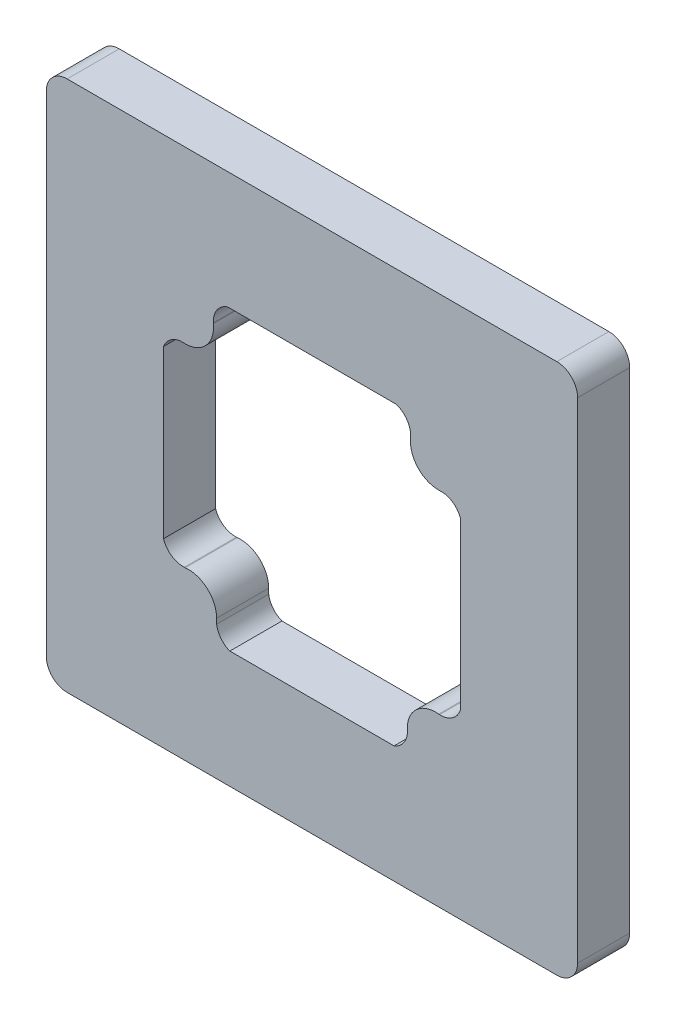
ISO-10303-21;
HEADER;
FILE_DESCRIPTION(('STEP AP214'),'2;1');
FILE_NAME('part.step','',(''),(''),'','','');
FILE_SCHEMA(('AUTOMOTIVE_DESIGN { 1 0 10303 214 1 1 1 1 }'));
ENDSEC;
DATA;
#1=APPLICATION_CONTEXT('core data for automotive mechanical design processes');
#2=APPLICATION_PROTOCOL_DEFINITION('international standard','automotive_design',2000,#1);
#3=PRODUCT_CONTEXT('',#1,'mechanical');
#4=PRODUCT('Part','Part','',(#3));
#5=PRODUCT_RELATED_PRODUCT_CATEGORY('part','',(#4));
#6=PRODUCT_DEFINITION_FORMATION('','',#4);
#7=PRODUCT_DEFINITION_CONTEXT('part definition',#1,'design');
#8=PRODUCT_DEFINITION('design','',#6,#7);
#9=PRODUCT_DEFINITION_SHAPE('','',#8);
#10=(LENGTH_UNIT() NAMED_UNIT(*) SI_UNIT(.MILLI.,.METRE.));
#11=(NAMED_UNIT(*) PLANE_ANGLE_UNIT() SI_UNIT($,.RADIAN.));
#12=(NAMED_UNIT(*) SI_UNIT($,.STERADIAN.) SOLID_ANGLE_UNIT());
#13=UNCERTAINTY_MEASURE_WITH_UNIT(LENGTH_MEASURE(1.E-05),#10,'distance_accuracy_value','');
#14=(GEOMETRIC_REPRESENTATION_CONTEXT(3) GLOBAL_UNCERTAINTY_ASSIGNED_CONTEXT((#13)) GLOBAL_UNIT_ASSIGNED_CONTEXT((#10,
#11,#12)) REPRESENTATION_CONTEXT('',''));
#15=CARTESIAN_POINT('',(0.,0.,0.));
#16=DIRECTION('',(0.,0.,1.));
#17=DIRECTION('',(1.,0.,0.));
#18=AXIS2_PLACEMENT_3D('',#15,#16,#17);
#19=CARTESIAN_POINT('',(-47.,-47.,5.));
#20=DIRECTION('',(0.,0.,1.));
#21=DIRECTION('',(1.,0.,0.));
#22=AXIS2_PLACEMENT_3D('',#19,#20,#21);
#23=PLANE('',#22);
#24=CARTESIAN_POINT('',(-47.,-47.,5.));
#25=DIRECTION('',(0.,0.,1.));
#26=DIRECTION('',(1.,0.,0.));
#27=AXIS2_PLACEMENT_3D('',#24,#25,#26);
#28=CIRCLE('',#27,4.);
#29=CARTESIAN_POINT('',(-51.,-47.,5.));
#30=VERTEX_POINT('',#29);
#31=CARTESIAN_POINT('',(-47.,-51.,5.));
#32=VERTEX_POINT('',#31);
#33=EDGE_CURVE('E498',#30,#32,#28,.T.);
#34=ORIENTED_EDGE('',*,*,#33,.T.);
#35=DIRECTION('',(1.,0.,0.));
#36=VECTOR('',#35,1.);
#37=CARTESIAN_POINT('',(-47.,-51.,5.));
#38=LINE('',#37,#36);
#39=CARTESIAN_POINT('',(47.,-51.,5.));
#40=VERTEX_POINT('',#39);
#41=EDGE_CURVE('E502',#32,#40,#38,.T.);
#42=ORIENTED_EDGE('',*,*,#41,.T.);
#43=CARTESIAN_POINT('',(47.,-47.,5.));
#44=DIRECTION('',(0.,0.,1.));
#45=DIRECTION('',(1.,0.,0.));
#46=AXIS2_PLACEMENT_3D('',#43,#44,#45);
#47=CIRCLE('',#46,4.);
#48=CARTESIAN_POINT('',(51.,-47.,5.));
#49=VERTEX_POINT('',#48);
#50=EDGE_CURVE('E506',#40,#49,#47,.T.);
#51=ORIENTED_EDGE('',*,*,#50,.T.);
#52=DIRECTION('',(0.,1.,0.));
#53=VECTOR('',#52,1.);
#54=CARTESIAN_POINT('',(51.,47.,5.));
#55=LINE('',#54,#53);
#56=CARTESIAN_POINT('',(51.,47.,5.));
#57=VERTEX_POINT('',#56);
#58=EDGE_CURVE('E509',#49,#57,#55,.T.);
#59=ORIENTED_EDGE('',*,*,#58,.T.);
#60=CARTESIAN_POINT('',(47.,47.,5.));
#61=DIRECTION('',(0.,0.,1.));
#62=DIRECTION('',(-1.,0.,0.));
#63=AXIS2_PLACEMENT_3D('',#60,#61,#62);
#64=CIRCLE('',#63,4.);
#65=CARTESIAN_POINT('',(47.,51.,5.));
#66=VERTEX_POINT('',#65);
#67=EDGE_CURVE('E512',#57,#66,#64,.T.);
#68=ORIENTED_EDGE('',*,*,#67,.T.);
#69=DIRECTION('',(-1.,0.,0.));
#70=VECTOR('',#69,1.);
#71=CARTESIAN_POINT('',(-47.,51.,5.));
#72=LINE('',#71,#70);
#73=CARTESIAN_POINT('',(-47.,51.,5.));
#74=VERTEX_POINT('',#73);
#75=EDGE_CURVE('E515',#66,#74,#72,.T.);
#76=ORIENTED_EDGE('',*,*,#75,.T.);
#77=CARTESIAN_POINT('',(-47.,47.,5.));
#78=DIRECTION('',(0.,0.,1.));
#79=DIRECTION('',(1.,0.,0.));
#80=AXIS2_PLACEMENT_3D('',#77,#78,#79);
#81=CIRCLE('',#80,3.99999999999999);
#82=CARTESIAN_POINT('',(-51.,47.,5.));
#83=VERTEX_POINT('',#82);
#84=EDGE_CURVE('E518',#74,#83,#81,.T.);
#85=ORIENTED_EDGE('',*,*,#84,.T.);
#86=DIRECTION('',(0.,-1.,0.));
#87=VECTOR('',#86,1.);
#88=CARTESIAN_POINT('',(-51.,47.,5.));
#89=LINE('',#88,#87);
#90=EDGE_CURVE('E521',#83,#30,#89,.T.);
#91=ORIENTED_EDGE('',*,*,#90,.T.);
#92=EDGE_LOOP('',(#34,#42,#51,#59,#68,#76,#85,#91));
#93=FACE_BOUND('',#92,.T.);
#94=DIRECTION('',(-1.,0.,0.));
#95=VECTOR('',#94,1.);
#96=CARTESIAN_POINT('',(-25.3142857142867,18.3000721519141,5.));
#97=LINE('',#96,#95);
#98=CARTESIAN_POINT('',(-24.3142857142867,18.3000721519141,5.));
#99=VERTEX_POINT('',#98);
#100=CARTESIAN_POINT('',(-25.3142857142867,18.3000721519141,5.));
#101=VERTEX_POINT('',#100);
#102=EDGE_CURVE('E258',#99,#101,#97,.T.);
#103=ORIENTED_EDGE('',*,*,#102,.F.);
#104=CARTESIAN_POINT('',(-24.3142857142866,23.7142857142872,5.));
#105=DIRECTION('',(0.,0.,-1.));
#106=DIRECTION('',(1.,0.,0.));
#107=AXIS2_PLACEMENT_3D('',#104,#105,#106);
#108=CIRCLE('',#107,5.41421356237309);
#109=CARTESIAN_POINT('',(-18.9357864376277,24.3351351565554,5.));
#110=VERTEX_POINT('',#109);
#111=EDGE_CURVE('E249',#110,#99,#108,.T.);
#112=ORIENTED_EDGE('',*,*,#111,.F.);
#113=DIRECTION('',(0.,-1.,0.));
#114=VECTOR('',#113,1.);
#115=CARTESIAN_POINT('',(-18.9357864376277,24.3351351565554,5.));
#116=LINE('',#115,#114);
#117=CARTESIAN_POINT('',(-18.9357864376278,24.5000000000015,5.));
#118=VERTEX_POINT('',#117);
#119=EDGE_CURVE('E338',#118,#110,#116,.T.);
#120=ORIENTED_EDGE('',*,*,#119,.F.);
#121=CARTESIAN_POINT('',(-14.9408403988752,24.7010128042281,5.));
#122=DIRECTION('',(0.,0.,1.));
#123=DIRECTION('',(1.,0.,0.));
#124=AXIS2_PLACEMENT_3D('',#121,#122,#123);
#125=CIRCLE('',#124,4.00000000000098);
#126=CARTESIAN_POINT('',(-16.1929171882011,28.5,5.));
#127=VERTEX_POINT('',#126);
#128=EDGE_CURVE('E335',#127,#118,#125,.T.);
#129=ORIENTED_EDGE('',*,*,#128,.F.);
#130=DIRECTION('',(-1.,0.,0.));
#131=VECTOR('',#130,1.);
#132=CARTESIAN_POINT('',(-16.1929171882011,28.5,5.));
#133=LINE('',#132,#131);
#134=CARTESIAN_POINT('',(16.1929171882011,28.5,5.));
#135=VERTEX_POINT('',#134);
#136=EDGE_CURVE('E332',#135,#127,#133,.T.);
#137=ORIENTED_EDGE('',*,*,#136,.F.);
#138=CARTESIAN_POINT('',(14.9408403988752,24.7010128042281,5.));
#139=DIRECTION('',(0.,0.,1.));
#140=DIRECTION('',(-1.,0.,0.));
#141=AXIS2_PLACEMENT_3D('',#138,#139,#140);
#142=CIRCLE('',#141,4.00000000000098);
#143=CARTESIAN_POINT('',(18.9357864376278,24.5000000000015,5.));
#144=VERTEX_POINT('',#143);
#145=EDGE_CURVE('E329',#144,#135,#142,.T.);
#146=ORIENTED_EDGE('',*,*,#145,.F.);
#147=DIRECTION('',(0.,1.,0.));
#148=VECTOR('',#147,1.);
#149=CARTESIAN_POINT('',(18.9357864376278,24.3351351565554,5.));
#150=LINE('',#149,#148);
#151=CARTESIAN_POINT('',(18.9357864376278,24.3351351565554,5.));
#152=VERTEX_POINT('',#151);
#153=EDGE_CURVE('E326',#152,#144,#150,.T.);
#154=ORIENTED_EDGE('',*,*,#153,.F.);
#155=CARTESIAN_POINT('',(24.3142857142867,23.7142857142872,5.));
#156=DIRECTION('',(0.,0.,-1.));
#157=DIRECTION('',(-1.,0.,0.));
#158=AXIS2_PLACEMENT_3D('',#155,#156,#157);
#159=CIRCLE('',#158,5.41421356237309);
#160=CARTESIAN_POINT('',(24.3142857142867,18.3000721519141,5.));
#161=VERTEX_POINT('',#160);
#162=EDGE_CURVE('E323',#161,#152,#159,.T.);
#163=ORIENTED_EDGE('',*,*,#162,.F.);
#164=DIRECTION('',(-1.,0.,0.));
#165=VECTOR('',#164,1.);
#166=CARTESIAN_POINT('',(25.3142857142867,18.3000721519141,5.));
#167=LINE('',#166,#165);
#168=CARTESIAN_POINT('',(25.3142857142867,18.3000721519141,5.));
#169=VERTEX_POINT('',#168);
#170=EDGE_CURVE('E320',#169,#161,#167,.T.);
#171=ORIENTED_EDGE('',*,*,#170,.F.);
#172=CARTESIAN_POINT('',(24.7628496387361,14.3382647039695,5.));
#173=DIRECTION('',(0.,0.,1.));
#174=DIRECTION('',(-1.,0.,0.));
#175=AXIS2_PLACEMENT_3D('',#172,#173,#174);
#176=CIRCLE('',#175,4.00000000000096);
#177=CARTESIAN_POINT('',(28.5,15.7643457596297,5.));
#178=VERTEX_POINT('',#177);
#179=EDGE_CURVE('E317',#178,#169,#176,.T.);
#180=ORIENTED_EDGE('',*,*,#179,.F.);
#181=DIRECTION('',(0.,1.,0.));
#182=VECTOR('',#181,1.);
#183=CARTESIAN_POINT('',(28.5,15.7643457596297,5.));
#184=LINE('',#183,#182);
#185=CARTESIAN_POINT('',(28.5,-16.1929171882011,5.));
#186=VERTEX_POINT('',#185);
#187=EDGE_CURVE('E314',#186,#178,#184,.T.);
#188=ORIENTED_EDGE('',*,*,#187,.F.);
#189=CARTESIAN_POINT('',(24.7010128042281,-14.9408403988752,5.));
#190=DIRECTION('',(0.,0.,1.));
#191=DIRECTION('',(-1.,0.,0.));
#192=AXIS2_PLACEMENT_3D('',#189,#190,#191);
#193=CIRCLE('',#192,4.000000000001);
#194=CARTESIAN_POINT('',(24.5000000000015,-18.9357864376277,5.));
#195=VERTEX_POINT('',#194);
#196=EDGE_CURVE('E311',#195,#186,#193,.T.);
#197=ORIENTED_EDGE('',*,*,#196,.F.);
#198=DIRECTION('',(1.,0.,0.));
#199=VECTOR('',#198,1.);
#200=CARTESIAN_POINT('',(24.3351351565554,-18.9357864376277,5.));
#201=LINE('',#200,#199);
#202=CARTESIAN_POINT('',(24.3351351565554,-18.9357864376277,5.));
#203=VERTEX_POINT('',#202);
#204=EDGE_CURVE('E308',#203,#195,#201,.T.);
#205=ORIENTED_EDGE('',*,*,#204,.F.);
#206=CARTESIAN_POINT('',(23.7142857142872,-24.3142857142866,5.));
#207=DIRECTION('',(0.,0.,-1.));
#208=DIRECTION('',(-1.,0.,0.));
#209=AXIS2_PLACEMENT_3D('',#206,#207,#208);
#210=CIRCLE('',#209,5.41421356237309);
#211=CARTESIAN_POINT('',(18.3000721519141,-24.3142857142867,5.));
#212=VERTEX_POINT('',#211);
#213=EDGE_CURVE('E305',#212,#203,#210,.T.);
#214=ORIENTED_EDGE('',*,*,#213,.F.);
#215=DIRECTION('',(0.,1.,0.));
#216=VECTOR('',#215,1.);
#217=CARTESIAN_POINT('',(18.3000721519141,-25.3142857142867,5.));
#218=LINE('',#217,#216);
#219=CARTESIAN_POINT('',(18.3000721519141,-25.3142857142867,5.));
#220=VERTEX_POINT('',#219);
#221=EDGE_CURVE('E302',#220,#212,#218,.T.);
#222=ORIENTED_EDGE('',*,*,#221,.F.);
#223=CARTESIAN_POINT('',(14.3382647039695,-24.7628496387361,5.));
#224=DIRECTION('',(0.,0.,1.));
#225=DIRECTION('',(-1.,0.,0.));
#226=AXIS2_PLACEMENT_3D('',#223,#224,#225);
#227=CIRCLE('',#226,4.00000000000096);
#228=CARTESIAN_POINT('',(15.7643457596297,-28.5,5.));
#229=VERTEX_POINT('',#228);
#230=EDGE_CURVE('E299',#229,#220,#227,.T.);
#231=ORIENTED_EDGE('',*,*,#230,.F.);
#232=DIRECTION('',(1.,0.,0.));
#233=VECTOR('',#232,1.);
#234=CARTESIAN_POINT('',(-15.7643457596297,-28.5,5.));
#235=LINE('',#234,#233);
#236=CARTESIAN_POINT('',(-15.7643457596297,-28.5,5.));
#237=VERTEX_POINT('',#236);
#238=EDGE_CURVE('E296',#237,#229,#235,.T.);
#239=ORIENTED_EDGE('',*,*,#238,.F.);
#240=CARTESIAN_POINT('',(-14.3382647039695,-24.7628496387361,5.));
#241=DIRECTION('',(0.,0.,1.));
#242=DIRECTION('',(1.,0.,0.));
#243=AXIS2_PLACEMENT_3D('',#240,#241,#242);
#244=CIRCLE('',#243,4.00000000000095);
#245=CARTESIAN_POINT('',(-18.3000721519141,-25.3142857142867,5.));
#246=VERTEX_POINT('',#245);
#247=EDGE_CURVE('E293',#246,#237,#244,.T.);
#248=ORIENTED_EDGE('',*,*,#247,.F.);
#249=DIRECTION('',(0.,-1.,0.));
#250=VECTOR('',#249,1.);
#251=CARTESIAN_POINT('',(-18.3000721519141,-25.3142857142867,5.));
#252=LINE('',#251,#250);
#253=CARTESIAN_POINT('',(-18.3000721519141,-24.3142857142867,5.));
#254=VERTEX_POINT('',#253);
#255=EDGE_CURVE('E290',#254,#246,#252,.T.);
#256=ORIENTED_EDGE('',*,*,#255,.F.);
#257=CARTESIAN_POINT('',(-23.7142857142872,-24.3142857142866,5.));
#258=DIRECTION('',(0.,0.,-1.));
#259=DIRECTION('',(1.,0.,0.));
#260=AXIS2_PLACEMENT_3D('',#257,#258,#259);
#261=CIRCLE('',#260,5.4142135623731);
#262=CARTESIAN_POINT('',(-24.3351351565554,-18.9357864376278,5.));
#263=VERTEX_POINT('',#262);
#264=EDGE_CURVE('E287',#263,#254,#261,.T.);
#265=ORIENTED_EDGE('',*,*,#264,.F.);
#266=DIRECTION('',(1.,1.26265134983278E-13,0.));
#267=VECTOR('',#266,1.);
#268=CARTESIAN_POINT('',(-24.3351351565554,-18.9357864376277,5.));
#269=LINE('',#268,#267);
#270=CARTESIAN_POINT('',(-24.5000000000015,-18.9357864376278,5.));
#271=VERTEX_POINT('',#270);
#272=EDGE_CURVE('E284',#271,#263,#269,.T.);
#273=ORIENTED_EDGE('',*,*,#272,.F.);
#274=CARTESIAN_POINT('',(-24.7010128042281,-14.9408403988752,5.));
#275=DIRECTION('',(0.,0.,1.));
#276=DIRECTION('',(1.,0.,0.));
#277=AXIS2_PLACEMENT_3D('',#274,#275,#276);
#278=CIRCLE('',#277,4.000000000001);
#279=CARTESIAN_POINT('',(-28.5,-16.1929171882011,5.));
#280=VERTEX_POINT('',#279);
#281=EDGE_CURVE('E281',#280,#271,#278,.T.);
#282=ORIENTED_EDGE('',*,*,#281,.F.);
#283=DIRECTION('',(0.,-1.,0.));
#284=VECTOR('',#283,1.);
#285=CARTESIAN_POINT('',(-28.5,15.7643457596297,5.));
#286=LINE('',#285,#284);
#287=CARTESIAN_POINT('',(-28.5,15.7643457596297,5.));
#288=VERTEX_POINT('',#287);
#289=EDGE_CURVE('E276',#288,#280,#286,.T.);
#290=ORIENTED_EDGE('',*,*,#289,.F.);
#291=CARTESIAN_POINT('',(-24.7628496387361,14.3382647039695,5.));
#292=DIRECTION('',(0.,0.,1.));
#293=DIRECTION('',(1.,0.,0.));
#294=AXIS2_PLACEMENT_3D('',#291,#292,#293);
#295=CIRCLE('',#294,4.00000000000096);
#296=EDGE_CURVE('E272',#101,#288,#295,.T.);
#297=ORIENTED_EDGE('',*,*,#296,.F.);
#298=EDGE_LOOP('',(#103,#112,#120,#129,#137,#146,#154,#163,#171,#180,#188,#197,#205,#214,#222,
#231,#239,#248,#256,#265,#273,#282,#290,#297));
#299=FACE_BOUND('',#298,.T.);
#300=ADVANCED_FACE('F39',(#93,#299),#23,.T.);
#301=CARTESIAN_POINT('',(-47.,-47.,-5.));
#302=DIRECTION('',(0.,0.,1.));
#303=DIRECTION('',(1.,0.,0.));
#304=AXIS2_PLACEMENT_3D('',#301,#302,#303);
#305=PLANE('',#304);
#306=CARTESIAN_POINT('',(-47.,-47.,-5.));
#307=DIRECTION('',(0.,0.,1.));
#308=DIRECTION('',(1.,0.,0.));
#309=AXIS2_PLACEMENT_3D('',#306,#307,#308);
#310=CIRCLE('',#309,4.);
#311=CARTESIAN_POINT('',(-51.,-47.,-5.));
#312=VERTEX_POINT('',#311);
#313=CARTESIAN_POINT('',(-47.,-51.,-5.));
#314=VERTEX_POINT('',#313);
#315=EDGE_CURVE('E267',#312,#314,#310,.T.);
#316=ORIENTED_EDGE('',*,*,#315,.F.);
#317=DIRECTION('',(0.,-1.,0.));
#318=VECTOR('',#317,1.);
#319=CARTESIAN_POINT('',(-51.,47.,-5.));
#320=LINE('',#319,#318);
#321=CARTESIAN_POINT('',(-51.,47.,-5.));
#322=VERTEX_POINT('',#321);
#323=EDGE_CURVE('E503',#322,#312,#320,.T.);
#324=ORIENTED_EDGE('',*,*,#323,.F.);
#325=CARTESIAN_POINT('',(-47.,47.,-5.));
#326=DIRECTION('',(0.,0.,1.));
#327=DIRECTION('',(1.,0.,0.));
#328=AXIS2_PLACEMENT_3D('',#325,#326,#327);
#329=CIRCLE('',#328,3.99999999999999);
#330=CARTESIAN_POINT('',(-47.,51.,-5.));
#331=VERTEX_POINT('',#330);
#332=EDGE_CURVE('E543',#331,#322,#329,.T.);
#333=ORIENTED_EDGE('',*,*,#332,.F.);
#334=DIRECTION('',(-1.,0.,0.));
#335=VECTOR('',#334,1.);
#336=CARTESIAN_POINT('',(-47.,51.,-5.));
#337=LINE('',#336,#335);
#338=CARTESIAN_POINT('',(47.,51.,-5.));
#339=VERTEX_POINT('',#338);
#340=EDGE_CURVE('E540',#339,#331,#337,.T.);
#341=ORIENTED_EDGE('',*,*,#340,.F.);
#342=CARTESIAN_POINT('',(47.,47.,-5.));
#343=DIRECTION('',(0.,0.,1.));
#344=DIRECTION('',(-1.,0.,0.));
#345=AXIS2_PLACEMENT_3D('',#342,#343,#344);
#346=CIRCLE('',#345,4.);
#347=CARTESIAN_POINT('',(51.,47.,-5.));
#348=VERTEX_POINT('',#347);
#349=EDGE_CURVE('E537',#348,#339,#346,.T.);
#350=ORIENTED_EDGE('',*,*,#349,.F.);
#351=DIRECTION('',(0.,1.,0.));
#352=VECTOR('',#351,1.);
#353=CARTESIAN_POINT('',(51.,47.,-5.));
#354=LINE('',#353,#352);
#355=CARTESIAN_POINT('',(51.,-47.,-5.));
#356=VERTEX_POINT('',#355);
#357=EDGE_CURVE('E534',#356,#348,#354,.T.);
#358=ORIENTED_EDGE('',*,*,#357,.F.);
#359=CARTESIAN_POINT('',(47.,-47.,-5.));
#360=DIRECTION('',(0.,0.,1.));
#361=DIRECTION('',(1.,0.,0.));
#362=AXIS2_PLACEMENT_3D('',#359,#360,#361);
#363=CIRCLE('',#362,4.);
#364=CARTESIAN_POINT('',(47.,-51.,-5.));
#365=VERTEX_POINT('',#364);
#366=EDGE_CURVE('E531',#365,#356,#363,.T.);
#367=ORIENTED_EDGE('',*,*,#366,.F.);
#368=DIRECTION('',(1.,0.,0.));
#369=VECTOR('',#368,1.);
#370=CARTESIAN_POINT('',(-47.,-51.,-5.));
#371=LINE('',#370,#369);
#372=EDGE_CURVE('E528',#314,#365,#371,.T.);
#373=ORIENTED_EDGE('',*,*,#372,.F.);
#374=EDGE_LOOP('',(#316,#324,#333,#341,#350,#358,#367,#373));
#375=FACE_BOUND('',#374,.T.);
#376=CARTESIAN_POINT('',(-24.3142857142866,23.7142857142872,-5.));
#377=DIRECTION('',(0.,0.,-1.));
#378=DIRECTION('',(1.,0.,0.));
#379=AXIS2_PLACEMENT_3D('',#376,#377,#378);
#380=CIRCLE('',#379,5.41421356237309);
#381=CARTESIAN_POINT('',(-18.9357864376277,24.3351351565554,-5.));
#382=VERTEX_POINT('',#381);
#383=CARTESIAN_POINT('',(-24.3142857142867,18.3000721519141,-5.));
#384=VERTEX_POINT('',#383);
#385=EDGE_CURVE('E63',#382,#384,#380,.T.);
#386=ORIENTED_EDGE('',*,*,#385,.T.);
#387=DIRECTION('',(-1.,0.,0.));
#388=VECTOR('',#387,1.);
#389=CARTESIAN_POINT('',(-25.3142857142867,18.3000721519141,-5.));
#390=LINE('',#389,#388);
#391=CARTESIAN_POINT('',(-25.3142857142867,18.3000721519141,-5.));
#392=VERTEX_POINT('',#391);
#393=EDGE_CURVE('E265',#384,#392,#390,.T.);
#394=ORIENTED_EDGE('',*,*,#393,.T.);
#395=CARTESIAN_POINT('',(-24.7628496387361,14.3382647039695,-5.));
#396=DIRECTION('',(0.,0.,1.));
#397=DIRECTION('',(1.,0.,0.));
#398=AXIS2_PLACEMENT_3D('',#395,#396,#397);
#399=CIRCLE('',#398,4.00000000000096);
#400=CARTESIAN_POINT('',(-28.5,15.7643457596297,-5.));
#401=VERTEX_POINT('',#400);
#402=EDGE_CURVE('E345',#392,#401,#399,.T.);
#403=ORIENTED_EDGE('',*,*,#402,.T.);
#404=DIRECTION('',(0.,-1.,0.));
#405=VECTOR('',#404,1.);
#406=CARTESIAN_POINT('',(-28.5,15.7643457596297,-5.));
#407=LINE('',#406,#405);
#408=CARTESIAN_POINT('',(-28.5,-16.1929171882011,-5.));
#409=VERTEX_POINT('',#408);
#410=EDGE_CURVE('E349',#401,#409,#407,.T.);
#411=ORIENTED_EDGE('',*,*,#410,.T.);
#412=CARTESIAN_POINT('',(-24.7010128042281,-14.9408403988752,-5.));
#413=DIRECTION('',(0.,0.,1.));
#414=DIRECTION('',(1.,0.,0.));
#415=AXIS2_PLACEMENT_3D('',#412,#413,#414);
#416=CIRCLE('',#415,4.000000000001);
#417=CARTESIAN_POINT('',(-24.5000000000015,-18.9357864376278,-5.));
#418=VERTEX_POINT('',#417);
#419=EDGE_CURVE('E353',#409,#418,#416,.T.);
#420=ORIENTED_EDGE('',*,*,#419,.T.);
#421=DIRECTION('',(1.,1.26265134983278E-13,0.));
#422=VECTOR('',#421,1.);
#423=CARTESIAN_POINT('',(-24.3351351565554,-18.9357864376277,-5.));
#424=LINE('',#423,#422);
#425=CARTESIAN_POINT('',(-24.3351351565554,-18.9357864376278,-5.));
#426=VERTEX_POINT('',#425);
#427=EDGE_CURVE('E357',#418,#426,#424,.T.);
#428=ORIENTED_EDGE('',*,*,#427,.T.);
#429=CARTESIAN_POINT('',(-23.7142857142872,-24.3142857142866,-5.));
#430=DIRECTION('',(0.,0.,-1.));
#431=DIRECTION('',(1.,0.,0.));
#432=AXIS2_PLACEMENT_3D('',#429,#430,#431);
#433=CIRCLE('',#432,5.4142135623731);
#434=CARTESIAN_POINT('',(-18.3000721519141,-24.3142857142867,-5.));
#435=VERTEX_POINT('',#434);
#436=EDGE_CURVE('E361',#426,#435,#433,.T.);
#437=ORIENTED_EDGE('',*,*,#436,.T.);
#438=DIRECTION('',(0.,-1.,0.));
#439=VECTOR('',#438,1.);
#440=CARTESIAN_POINT('',(-18.3000721519141,-25.3142857142867,-5.));
#441=LINE('',#440,#439);
#442=CARTESIAN_POINT('',(-18.3000721519141,-25.3142857142867,-5.));
#443=VERTEX_POINT('',#442);
#444=EDGE_CURVE('E365',#435,#443,#441,.T.);
#445=ORIENTED_EDGE('',*,*,#444,.T.);
#446=CARTESIAN_POINT('',(-14.3382647039695,-24.7628496387361,-5.));
#447=DIRECTION('',(0.,0.,1.));
#448=DIRECTION('',(1.,0.,0.));
#449=AXIS2_PLACEMENT_3D('',#446,#447,#448);
#450=CIRCLE('',#449,4.00000000000095);
#451=CARTESIAN_POINT('',(-15.7643457596297,-28.5,-5.));
#452=VERTEX_POINT('',#451);
#453=EDGE_CURVE('E369',#443,#452,#450,.T.);
#454=ORIENTED_EDGE('',*,*,#453,.T.);
#455=DIRECTION('',(1.,0.,0.));
#456=VECTOR('',#455,1.);
#457=CARTESIAN_POINT('',(-15.7643457596297,-28.5,-5.));
#458=LINE('',#457,#456);
#459=CARTESIAN_POINT('',(15.7643457596297,-28.5,-5.));
#460=VERTEX_POINT('',#459);
#461=EDGE_CURVE('E373',#452,#460,#458,.T.);
#462=ORIENTED_EDGE('',*,*,#461,.T.);
#463=CARTESIAN_POINT('',(14.3382647039695,-24.7628496387361,-5.));
#464=DIRECTION('',(0.,0.,1.));
#465=DIRECTION('',(-1.,0.,0.));
#466=AXIS2_PLACEMENT_3D('',#463,#464,#465);
#467=CIRCLE('',#466,4.00000000000096);
#468=CARTESIAN_POINT('',(18.3000721519141,-25.3142857142867,-5.));
#469=VERTEX_POINT('',#468);
#470=EDGE_CURVE('E377',#460,#469,#467,.T.);
#471=ORIENTED_EDGE('',*,*,#470,.T.);
#472=DIRECTION('',(0.,1.,0.));
#473=VECTOR('',#472,1.);
#474=CARTESIAN_POINT('',(18.3000721519141,-25.3142857142867,-5.));
#475=LINE('',#474,#473);
#476=CARTESIAN_POINT('',(18.3000721519141,-24.3142857142867,-5.));
#477=VERTEX_POINT('',#476);
#478=EDGE_CURVE('E381',#469,#477,#475,.T.);
#479=ORIENTED_EDGE('',*,*,#478,.T.);
#480=CARTESIAN_POINT('',(23.7142857142872,-24.3142857142866,-5.));
#481=DIRECTION('',(0.,0.,-1.));
#482=DIRECTION('',(-1.,0.,0.));
#483=AXIS2_PLACEMENT_3D('',#480,#481,#482);
#484=CIRCLE('',#483,5.41421356237309);
#485=CARTESIAN_POINT('',(24.3351351565554,-18.9357864376277,-5.));
#486=VERTEX_POINT('',#485);
#487=EDGE_CURVE('E385',#477,#486,#484,.T.);
#488=ORIENTED_EDGE('',*,*,#487,.T.);
#489=DIRECTION('',(1.,0.,0.));
#490=VECTOR('',#489,1.);
#491=CARTESIAN_POINT('',(24.3351351565554,-18.9357864376277,-5.));
#492=LINE('',#491,#490);
#493=CARTESIAN_POINT('',(24.5000000000015,-18.9357864376277,-5.));
#494=VERTEX_POINT('',#493);
#495=EDGE_CURVE('E389',#486,#494,#492,.T.);
#496=ORIENTED_EDGE('',*,*,#495,.T.);
#497=CARTESIAN_POINT('',(24.7010128042281,-14.9408403988752,-5.));
#498=DIRECTION('',(0.,0.,1.));
#499=DIRECTION('',(-1.,0.,0.));
#500=AXIS2_PLACEMENT_3D('',#497,#498,#499);
#501=CIRCLE('',#500,4.000000000001);
#502=CARTESIAN_POINT('',(28.5,-16.1929171882011,-5.));
#503=VERTEX_POINT('',#502);
#504=EDGE_CURVE('E393',#494,#503,#501,.T.);
#505=ORIENTED_EDGE('',*,*,#504,.T.);
#506=DIRECTION('',(0.,1.,0.));
#507=VECTOR('',#506,1.);
#508=CARTESIAN_POINT('',(28.5,15.7643457596297,-5.));
#509=LINE('',#508,#507);
#510=CARTESIAN_POINT('',(28.5,15.7643457596297,-5.));
#511=VERTEX_POINT('',#510);
#512=EDGE_CURVE('E397',#503,#511,#509,.T.);
#513=ORIENTED_EDGE('',*,*,#512,.T.);
#514=CARTESIAN_POINT('',(24.7628496387361,14.3382647039695,-5.));
#515=DIRECTION('',(0.,0.,1.));
#516=DIRECTION('',(-1.,0.,0.));
#517=AXIS2_PLACEMENT_3D('',#514,#515,#516);
#518=CIRCLE('',#517,4.00000000000096);
#519=CARTESIAN_POINT('',(25.3142857142867,18.3000721519141,-5.));
#520=VERTEX_POINT('',#519);
#521=EDGE_CURVE('E401',#511,#520,#518,.T.);
#522=ORIENTED_EDGE('',*,*,#521,.T.);
#523=DIRECTION('',(-1.,0.,0.));
#524=VECTOR('',#523,1.);
#525=CARTESIAN_POINT('',(25.3142857142867,18.3000721519141,-5.));
#526=LINE('',#525,#524);
#527=CARTESIAN_POINT('',(24.3142857142867,18.3000721519141,-5.));
#528=VERTEX_POINT('',#527);
#529=EDGE_CURVE('E405',#520,#528,#526,.T.);
#530=ORIENTED_EDGE('',*,*,#529,.T.);
#531=CARTESIAN_POINT('',(24.3142857142867,23.7142857142872,-5.));
#532=DIRECTION('',(0.,0.,-1.));
#533=DIRECTION('',(-1.,0.,0.));
#534=AXIS2_PLACEMENT_3D('',#531,#532,#533);
#535=CIRCLE('',#534,5.41421356237309);
#536=CARTESIAN_POINT('',(18.9357864376278,24.3351351565554,-5.));
#537=VERTEX_POINT('',#536);
#538=EDGE_CURVE('E409',#528,#537,#535,.T.);
#539=ORIENTED_EDGE('',*,*,#538,.T.);
#540=DIRECTION('',(0.,1.,0.));
#541=VECTOR('',#540,1.);
#542=CARTESIAN_POINT('',(18.9357864376278,24.3351351565554,-5.));
#543=LINE('',#542,#541);
#544=CARTESIAN_POINT('',(18.9357864376278,24.5000000000015,-5.));
#545=VERTEX_POINT('',#544);
#546=EDGE_CURVE('E413',#537,#545,#543,.T.);
#547=ORIENTED_EDGE('',*,*,#546,.T.);
#548=CARTESIAN_POINT('',(14.9408403988752,24.7010128042281,-5.));
#549=DIRECTION('',(0.,0.,1.));
#550=DIRECTION('',(-1.,0.,0.));
#551=AXIS2_PLACEMENT_3D('',#548,#549,#550);
#552=CIRCLE('',#551,4.00000000000098);
#553=CARTESIAN_POINT('',(16.1929171882011,28.5,-5.));
#554=VERTEX_POINT('',#553);
#555=EDGE_CURVE('E417',#545,#554,#552,.T.);
#556=ORIENTED_EDGE('',*,*,#555,.T.);
#557=DIRECTION('',(-1.,0.,0.));
#558=VECTOR('',#557,1.);
#559=CARTESIAN_POINT('',(-16.1929171882011,28.5,-5.));
#560=LINE('',#559,#558);
#561=CARTESIAN_POINT('',(-16.1929171882011,28.5,-5.));
#562=VERTEX_POINT('',#561);
#563=EDGE_CURVE('E421',#554,#562,#560,.T.);
#564=ORIENTED_EDGE('',*,*,#563,.T.);
#565=CARTESIAN_POINT('',(-14.9408403988752,24.7010128042281,-5.));
#566=DIRECTION('',(0.,0.,1.));
#567=DIRECTION('',(1.,0.,0.));
#568=AXIS2_PLACEMENT_3D('',#565,#566,#567);
#569=CIRCLE('',#568,4.00000000000098);
#570=CARTESIAN_POINT('',(-18.9357864376278,24.5000000000015,-5.));
#571=VERTEX_POINT('',#570);
#572=EDGE_CURVE('E425',#562,#571,#569,.T.);
#573=ORIENTED_EDGE('',*,*,#572,.T.);
#574=DIRECTION('',(0.,-1.,0.));
#575=VECTOR('',#574,1.);
#576=CARTESIAN_POINT('',(-18.9357864376277,24.3351351565554,-5.));
#577=LINE('',#576,#575);
#578=EDGE_CURVE('E259',#571,#382,#577,.T.);
#579=ORIENTED_EDGE('',*,*,#578,.T.);
#580=EDGE_LOOP('',(#386,#394,#403,#411,#420,#428,#437,#445,#454,#462,#471,#479,#488,#496,#505,
#513,#522,#530,#539,#547,#556,#564,#573,#579));
#581=FACE_BOUND('',#580,.T.);
#582=ADVANCED_FACE('F582',(#375,#581),#305,.F.);
#583=CARTESIAN_POINT('',(-47.,-47.,5.));
#584=DIRECTION('',(0.,0.,-1.));
#585=DIRECTION('',(-1.,0.,0.));
#586=AXIS2_PLACEMENT_3D('',#583,#584,#585);
#587=CYLINDRICAL_SURFACE('',#586,4.);
#588=ORIENTED_EDGE('',*,*,#315,.T.);
#589=DIRECTION('',(0.,0.,-1.));
#590=VECTOR('',#589,1.);
#591=CARTESIAN_POINT('',(-47.,-51.,5.));
#592=LINE('',#591,#590);
#593=EDGE_CURVE('E11',#32,#314,#592,.T.);
#594=ORIENTED_EDGE('',*,*,#593,.F.);
#595=ORIENTED_EDGE('',*,*,#33,.F.);
#596=DIRECTION('',(0.,0.,-1.));
#597=VECTOR('',#596,1.);
#598=CARTESIAN_POINT('',(-51.,-47.,5.));
#599=LINE('',#598,#597);
#600=EDGE_CURVE('E524',#30,#312,#599,.T.);
#601=ORIENTED_EDGE('',*,*,#600,.T.);
#602=EDGE_LOOP('',(#588,#594,#595,#601));
#603=FACE_BOUND('',#602,.T.);
#604=ADVANCED_FACE('F41',(#603),#587,.T.);
#605=CARTESIAN_POINT('',(-47.,-51.,5.));
#606=DIRECTION('',(0.,1.,0.));
#607=DIRECTION('',(0.,0.,1.));
#608=AXIS2_PLACEMENT_3D('',#605,#606,#607);
#609=PLANE('',#608);
#610=ORIENTED_EDGE('',*,*,#372,.T.);
#611=DIRECTION('',(0.,0.,-1.));
#612=VECTOR('',#611,1.);
#613=CARTESIAN_POINT('',(47.,-51.,5.));
#614=LINE('',#613,#612);
#615=EDGE_CURVE('E48',#40,#365,#614,.T.);
#616=ORIENTED_EDGE('',*,*,#615,.F.);
#617=ORIENTED_EDGE('',*,*,#41,.F.);
#618=ORIENTED_EDGE('',*,*,#593,.T.);
#619=EDGE_LOOP('',(#610,#616,#617,#618));
#620=FACE_BOUND('',#619,.T.);
#621=ADVANCED_FACE('F599',(#620),#609,.F.);
#622=CARTESIAN_POINT('',(47.,-47.,5.));
#623=DIRECTION('',(0.,0.,-1.));
#624=DIRECTION('',(-1.,0.,0.));
#625=AXIS2_PLACEMENT_3D('',#622,#623,#624);
#626=CYLINDRICAL_SURFACE('',#625,4.);
#627=ORIENTED_EDGE('',*,*,#366,.T.);
#628=DIRECTION('',(0.,0.,-1.));
#629=VECTOR('',#628,1.);
#630=CARTESIAN_POINT('',(51.,-47.,5.));
#631=LINE('',#630,#629);
#632=EDGE_CURVE('E567',#49,#356,#631,.T.);
#633=ORIENTED_EDGE('',*,*,#632,.F.);
#634=ORIENTED_EDGE('',*,*,#50,.F.);
#635=ORIENTED_EDGE('',*,*,#615,.T.);
#636=EDGE_LOOP('',(#627,#633,#634,#635));
#637=FACE_BOUND('',#636,.T.);
#638=ADVANCED_FACE('F576',(#637),#626,.T.);
#639=CARTESIAN_POINT('',(51.,47.,5.));
#640=DIRECTION('',(-1.,0.,0.));
#641=DIRECTION('',(0.,0.,1.));
#642=AXIS2_PLACEMENT_3D('',#639,#640,#641);
#643=PLANE('',#642);
#644=ORIENTED_EDGE('',*,*,#357,.T.);
#645=DIRECTION('',(0.,0.,-1.));
#646=VECTOR('',#645,1.);
#647=CARTESIAN_POINT('',(51.,47.,5.));
#648=LINE('',#647,#646);
#649=EDGE_CURVE('E563',#57,#348,#648,.T.);
#650=ORIENTED_EDGE('',*,*,#649,.F.);
#651=ORIENTED_EDGE('',*,*,#58,.F.);
#652=ORIENTED_EDGE('',*,*,#632,.T.);
#653=EDGE_LOOP('',(#644,#650,#651,#652));
#654=FACE_BOUND('',#653,.T.);
#655=ADVANCED_FACE('F588',(#654),#643,.F.);
#656=CARTESIAN_POINT('',(47.,47.,5.));
#657=DIRECTION('',(0.,0.,-1.));
#658=DIRECTION('',(-1.,0.,0.));
#659=AXIS2_PLACEMENT_3D('',#656,#657,#658);
#660=CYLINDRICAL_SURFACE('',#659,4.);
#661=ORIENTED_EDGE('',*,*,#349,.T.);
#662=DIRECTION('',(0.,0.,-1.));
#663=VECTOR('',#662,1.);
#664=CARTESIAN_POINT('',(47.,51.,5.));
#665=LINE('',#664,#663);
#666=EDGE_CURVE('E559',#66,#339,#665,.T.);
#667=ORIENTED_EDGE('',*,*,#666,.F.);
#668=ORIENTED_EDGE('',*,*,#67,.F.);
#669=ORIENTED_EDGE('',*,*,#649,.T.);
#670=EDGE_LOOP('',(#661,#667,#668,#669));
#671=FACE_BOUND('',#670,.T.);
#672=ADVANCED_FACE('F592',(#671),#660,.T.);
#673=CARTESIAN_POINT('',(-47.,51.,5.));
#674=DIRECTION('',(0.,-1.,0.));
#675=DIRECTION('',(0.,0.,-1.));
#676=AXIS2_PLACEMENT_3D('',#673,#674,#675);
#677=PLANE('',#676);
#678=ORIENTED_EDGE('',*,*,#340,.T.);
#679=DIRECTION('',(0.,0.,-1.));
#680=VECTOR('',#679,1.);
#681=CARTESIAN_POINT('',(-47.,51.,5.));
#682=LINE('',#681,#680);
#683=EDGE_CURVE('E555',#74,#331,#682,.T.);
#684=ORIENTED_EDGE('',*,*,#683,.F.);
#685=ORIENTED_EDGE('',*,*,#75,.F.);
#686=ORIENTED_EDGE('',*,*,#666,.T.);
#687=EDGE_LOOP('',(#678,#684,#685,#686));
#688=FACE_BOUND('',#687,.T.);
#689=ADVANCED_FACE('F612',(#688),#677,.F.);
#690=CARTESIAN_POINT('',(-47.,47.,5.));
#691=DIRECTION('',(0.,0.,-1.));
#692=DIRECTION('',(-1.,0.,0.));
#693=AXIS2_PLACEMENT_3D('',#690,#691,#692);
#694=CYLINDRICAL_SURFACE('',#693,3.99999999999999);
#695=ORIENTED_EDGE('',*,*,#332,.T.);
#696=DIRECTION('',(0.,0.,-1.));
#697=VECTOR('',#696,1.);
#698=CARTESIAN_POINT('',(-51.,47.,5.));
#699=LINE('',#698,#697);
#700=EDGE_CURVE('E551',#83,#322,#699,.T.);
#701=ORIENTED_EDGE('',*,*,#700,.F.);
#702=ORIENTED_EDGE('',*,*,#84,.F.);
#703=ORIENTED_EDGE('',*,*,#683,.T.);
#704=EDGE_LOOP('',(#695,#701,#702,#703));
#705=FACE_BOUND('',#704,.T.);
#706=ADVANCED_FACE('F610',(#705),#694,.T.);
#707=CARTESIAN_POINT('',(-51.,47.,5.));
#708=DIRECTION('',(1.,0.,0.));
#709=DIRECTION('',(0.,1.,0.));
#710=AXIS2_PLACEMENT_3D('',#707,#708,#709);
#711=PLANE('',#710);
#712=ORIENTED_EDGE('',*,*,#323,.T.);
#713=ORIENTED_EDGE('',*,*,#600,.F.);
#714=ORIENTED_EDGE('',*,*,#90,.F.);
#715=ORIENTED_EDGE('',*,*,#700,.T.);
#716=EDGE_LOOP('',(#712,#713,#714,#715));
#717=FACE_BOUND('',#716,.T.);
#718=ADVANCED_FACE('F605',(#717),#711,.F.);
#719=CARTESIAN_POINT('',(-24.3142857142866,23.7142857142872,5.));
#720=DIRECTION('',(0.,0.,-1.));
#721=DIRECTION('',(-1.,0.,0.));
#722=AXIS2_PLACEMENT_3D('',#719,#720,#721);
#723=CYLINDRICAL_SURFACE('',#722,5.41421356237309);
#724=ORIENTED_EDGE('',*,*,#385,.F.);
#725=DIRECTION('',(0.,0.,-1.));
#726=VECTOR('',#725,1.);
#727=CARTESIAN_POINT('',(-18.9357864376277,24.3351351565554,5.));
#728=LINE('',#727,#726);
#729=EDGE_CURVE('E253',#110,#382,#728,.T.);
#730=ORIENTED_EDGE('',*,*,#729,.F.);
#731=ORIENTED_EDGE('',*,*,#111,.T.);
#732=DIRECTION('',(0.,0.,-1.));
#733=VECTOR('',#732,1.);
#734=CARTESIAN_POINT('',(-24.3142857142867,18.3000721519141,5.));
#735=LINE('',#734,#733);
#736=EDGE_CURVE('E252',#99,#384,#735,.T.);
#737=ORIENTED_EDGE('',*,*,#736,.T.);
#738=EDGE_LOOP('',(#724,#730,#731,#737));
#739=FACE_BOUND('',#738,.T.);
#740=ADVANCED_FACE('F251',(#739),#723,.T.);
#741=CARTESIAN_POINT('',(-25.3142857142867,18.3000721519141,5.));
#742=DIRECTION('',(0.,-1.,0.));
#743=DIRECTION('',(0.,0.,-1.));
#744=AXIS2_PLACEMENT_3D('',#741,#742,#743);
#745=PLANE('',#744);
#746=ORIENTED_EDGE('',*,*,#393,.F.);
#747=ORIENTED_EDGE('',*,*,#736,.F.);
#748=ORIENTED_EDGE('',*,*,#102,.T.);
#749=DIRECTION('',(0.,0.,-1.));
#750=VECTOR('',#749,1.);
#751=CARTESIAN_POINT('',(-25.3142857142867,18.3000721519141,5.));
#752=LINE('',#751,#750);
#753=EDGE_CURVE('E268',#101,#392,#752,.T.);
#754=ORIENTED_EDGE('',*,*,#753,.T.);
#755=EDGE_LOOP('',(#746,#747,#748,#754));
#756=FACE_BOUND('',#755,.T.);
#757=ADVANCED_FACE('F262',(#756),#745,.T.);
#758=CARTESIAN_POINT('',(-24.7628496387361,14.3382647039695,5.));
#759=DIRECTION('',(0.,0.,-1.));
#760=DIRECTION('',(-1.,0.,0.));
#761=AXIS2_PLACEMENT_3D('',#758,#759,#760);
#762=CYLINDRICAL_SURFACE('',#761,4.00000000000096);
#763=ORIENTED_EDGE('',*,*,#402,.F.);
#764=ORIENTED_EDGE('',*,*,#753,.F.);
#765=ORIENTED_EDGE('',*,*,#296,.T.);
#766=DIRECTION('',(0.,0.,-1.));
#767=VECTOR('',#766,1.);
#768=CARTESIAN_POINT('',(-28.5,15.7643457596297,5.));
#769=LINE('',#768,#767);
#770=EDGE_CURVE('E493',#288,#401,#769,.T.);
#771=ORIENTED_EDGE('',*,*,#770,.T.);
#772=EDGE_LOOP('',(#763,#764,#765,#771));
#773=FACE_BOUND('',#772,.T.);
#774=ADVANCED_FACE('F637',(#773),#762,.F.);
#775=CARTESIAN_POINT('',(-28.5,15.7643457596297,5.));
#776=DIRECTION('',(1.,0.,0.));
#777=DIRECTION('',(0.,1.,0.));
#778=AXIS2_PLACEMENT_3D('',#775,#776,#777);
#779=PLANE('',#778);
#780=ORIENTED_EDGE('',*,*,#410,.F.);
#781=ORIENTED_EDGE('',*,*,#770,.F.);
#782=ORIENTED_EDGE('',*,*,#289,.T.);
#783=DIRECTION('',(0.,0.,-1.));
#784=VECTOR('',#783,1.);
#785=CARTESIAN_POINT('',(-28.5,-16.1929171882011,5.));
#786=LINE('',#785,#784);
#787=EDGE_CURVE('E490',#280,#409,#786,.T.);
#788=ORIENTED_EDGE('',*,*,#787,.T.);
#789=EDGE_LOOP('',(#780,#781,#782,#788));
#790=FACE_BOUND('',#789,.T.);
#791=ADVANCED_FACE('F641',(#790),#779,.T.);
#792=CARTESIAN_POINT('',(-24.7010128042281,-14.9408403988752,5.));
#793=DIRECTION('',(0.,0.,-1.));
#794=DIRECTION('',(-1.,0.,0.));
#795=AXIS2_PLACEMENT_3D('',#792,#793,#794);
#796=CYLINDRICAL_SURFACE('',#795,4.000000000001);
#797=ORIENTED_EDGE('',*,*,#419,.F.);
#798=ORIENTED_EDGE('',*,*,#787,.F.);
#799=ORIENTED_EDGE('',*,*,#281,.T.);
#800=DIRECTION('',(0.,0.,-1.));
#801=VECTOR('',#800,1.);
#802=CARTESIAN_POINT('',(-24.5000000000015,-18.9357864376278,5.));
#803=LINE('',#802,#801);
#804=EDGE_CURVE('E487',#271,#418,#803,.T.);
#805=ORIENTED_EDGE('',*,*,#804,.T.);
#806=EDGE_LOOP('',(#797,#798,#799,#805));
#807=FACE_BOUND('',#806,.T.);
#808=ADVANCED_FACE('F647',(#807),#796,.F.);
#809=CARTESIAN_POINT('',(-24.3351351565554,-18.9357864376277,5.));
#810=DIRECTION('',(-1.26265134983278E-13,1.,0.));
#811=DIRECTION('',(-1.,-1.26265134983278E-13,0.));
#812=AXIS2_PLACEMENT_3D('',#809,#810,#811);
#813=PLANE('',#812);
#814=ORIENTED_EDGE('',*,*,#427,.F.);
#815=ORIENTED_EDGE('',*,*,#804,.F.);
#816=ORIENTED_EDGE('',*,*,#272,.T.);
#817=DIRECTION('',(0.,0.,-1.));
#818=VECTOR('',#817,1.);
#819=CARTESIAN_POINT('',(-24.3351351565554,-18.9357864376278,5.));
#820=LINE('',#819,#818);
#821=EDGE_CURVE('E484',#263,#426,#820,.T.);
#822=ORIENTED_EDGE('',*,*,#821,.T.);
#823=EDGE_LOOP('',(#814,#815,#816,#822));
#824=FACE_BOUND('',#823,.T.);
#825=ADVANCED_FACE('F651',(#824),#813,.T.);
#826=CARTESIAN_POINT('',(-23.7142857142872,-24.3142857142866,5.));
#827=DIRECTION('',(0.,0.,-1.));
#828=DIRECTION('',(-1.,0.,0.));
#829=AXIS2_PLACEMENT_3D('',#826,#827,#828);
#830=CYLINDRICAL_SURFACE('',#829,5.4142135623731);
#831=ORIENTED_EDGE('',*,*,#436,.F.);
#832=ORIENTED_EDGE('',*,*,#821,.F.);
#833=ORIENTED_EDGE('',*,*,#264,.T.);
#834=DIRECTION('',(0.,0.,-1.));
#835=VECTOR('',#834,1.);
#836=CARTESIAN_POINT('',(-18.3000721519141,-24.3142857142867,5.));
#837=LINE('',#836,#835);
#838=EDGE_CURVE('E481',#254,#435,#837,.T.);
#839=ORIENTED_EDGE('',*,*,#838,.T.);
#840=EDGE_LOOP('',(#831,#832,#833,#839));
#841=FACE_BOUND('',#840,.T.);
#842=ADVANCED_FACE('F655',(#841),#830,.T.);
#843=CARTESIAN_POINT('',(-18.3000721519141,-25.3142857142867,5.));
#844=DIRECTION('',(1.,0.,0.));
#845=DIRECTION('',(0.,1.,0.));
#846=AXIS2_PLACEMENT_3D('',#843,#844,#845);
#847=PLANE('',#846);
#848=ORIENTED_EDGE('',*,*,#444,.F.);
#849=ORIENTED_EDGE('',*,*,#838,.F.);
#850=ORIENTED_EDGE('',*,*,#255,.T.);
#851=DIRECTION('',(0.,0.,-1.));
#852=VECTOR('',#851,1.);
#853=CARTESIAN_POINT('',(-18.3000721519141,-25.3142857142867,5.));
#854=LINE('',#853,#852);
#855=EDGE_CURVE('E478',#246,#443,#854,.T.);
#856=ORIENTED_EDGE('',*,*,#855,.T.);
#857=EDGE_LOOP('',(#848,#849,#850,#856));
#858=FACE_BOUND('',#857,.T.);
#859=ADVANCED_FACE('F659',(#858),#847,.T.);
#860=CARTESIAN_POINT('',(-14.3382647039695,-24.7628496387361,5.));
#861=DIRECTION('',(0.,0.,-1.));
#862=DIRECTION('',(-1.,0.,0.));
#863=AXIS2_PLACEMENT_3D('',#860,#861,#862);
#864=CYLINDRICAL_SURFACE('',#863,4.00000000000095);
#865=ORIENTED_EDGE('',*,*,#453,.F.);
#866=ORIENTED_EDGE('',*,*,#855,.F.);
#867=ORIENTED_EDGE('',*,*,#247,.T.);
#868=DIRECTION('',(0.,0.,-1.));
#869=VECTOR('',#868,1.);
#870=CARTESIAN_POINT('',(-15.7643457596297,-28.5,5.));
#871=LINE('',#870,#869);
#872=EDGE_CURVE('E475',#237,#452,#871,.T.);
#873=ORIENTED_EDGE('',*,*,#872,.T.);
#874=EDGE_LOOP('',(#865,#866,#867,#873));
#875=FACE_BOUND('',#874,.T.);
#876=ADVANCED_FACE('F663',(#875),#864,.F.);
#877=CARTESIAN_POINT('',(-15.7643457596297,-28.5,5.));
#878=DIRECTION('',(0.,1.,0.));
#879=DIRECTION('',(0.,0.,1.));
#880=AXIS2_PLACEMENT_3D('',#877,#878,#879);
#881=PLANE('',#880);
#882=ORIENTED_EDGE('',*,*,#461,.F.);
#883=ORIENTED_EDGE('',*,*,#872,.F.);
#884=ORIENTED_EDGE('',*,*,#238,.T.);
#885=DIRECTION('',(0.,0.,-1.));
#886=VECTOR('',#885,1.);
#887=CARTESIAN_POINT('',(15.7643457596297,-28.5,5.));
#888=LINE('',#887,#886);
#889=EDGE_CURVE('E472',#229,#460,#888,.T.);
#890=ORIENTED_EDGE('',*,*,#889,.T.);
#891=EDGE_LOOP('',(#882,#883,#884,#890));
#892=FACE_BOUND('',#891,.T.);
#893=ADVANCED_FACE('F667',(#892),#881,.T.);
#894=CARTESIAN_POINT('',(14.3382647039695,-24.7628496387361,5.));
#895=DIRECTION('',(0.,0.,-1.));
#896=DIRECTION('',(-1.,0.,0.));
#897=AXIS2_PLACEMENT_3D('',#894,#895,#896);
#898=CYLINDRICAL_SURFACE('',#897,4.00000000000096);
#899=ORIENTED_EDGE('',*,*,#470,.F.);
#900=ORIENTED_EDGE('',*,*,#889,.F.);
#901=ORIENTED_EDGE('',*,*,#230,.T.);
#902=DIRECTION('',(0.,0.,-1.));
#903=VECTOR('',#902,1.);
#904=CARTESIAN_POINT('',(18.3000721519141,-25.3142857142867,5.));
#905=LINE('',#904,#903);
#906=EDGE_CURVE('E469',#220,#469,#905,.T.);
#907=ORIENTED_EDGE('',*,*,#906,.T.);
#908=EDGE_LOOP('',(#899,#900,#901,#907));
#909=FACE_BOUND('',#908,.T.);
#910=ADVANCED_FACE('F671',(#909),#898,.F.);
#911=CARTESIAN_POINT('',(18.3000721519141,-25.3142857142867,5.));
#912=DIRECTION('',(-1.,0.,0.));
#913=DIRECTION('',(0.,-1.,0.));
#914=AXIS2_PLACEMENT_3D('',#911,#912,#913);
#915=PLANE('',#914);
#916=ORIENTED_EDGE('',*,*,#478,.F.);
#917=ORIENTED_EDGE('',*,*,#906,.F.);
#918=ORIENTED_EDGE('',*,*,#221,.T.);
#919=DIRECTION('',(0.,0.,-1.));
#920=VECTOR('',#919,1.);
#921=CARTESIAN_POINT('',(18.3000721519141,-24.3142857142867,5.));
#922=LINE('',#921,#920);
#923=EDGE_CURVE('E466',#212,#477,#922,.T.);
#924=ORIENTED_EDGE('',*,*,#923,.T.);
#925=EDGE_LOOP('',(#916,#917,#918,#924));
#926=FACE_BOUND('',#925,.T.);
#927=ADVANCED_FACE('F675',(#926),#915,.T.);
#928=CARTESIAN_POINT('',(23.7142857142872,-24.3142857142866,5.));
#929=DIRECTION('',(0.,0.,-1.));
#930=DIRECTION('',(-1.,0.,0.));
#931=AXIS2_PLACEMENT_3D('',#928,#929,#930);
#932=CYLINDRICAL_SURFACE('',#931,5.41421356237309);
#933=ORIENTED_EDGE('',*,*,#487,.F.);
#934=ORIENTED_EDGE('',*,*,#923,.F.);
#935=ORIENTED_EDGE('',*,*,#213,.T.);
#936=DIRECTION('',(0.,0.,-1.));
#937=VECTOR('',#936,1.);
#938=CARTESIAN_POINT('',(24.3351351565554,-18.9357864376277,5.));
#939=LINE('',#938,#937);
#940=EDGE_CURVE('E463',#203,#486,#939,.T.);
#941=ORIENTED_EDGE('',*,*,#940,.T.);
#942=EDGE_LOOP('',(#933,#934,#935,#941));
#943=FACE_BOUND('',#942,.T.);
#944=ADVANCED_FACE('F679',(#943),#932,.T.);
#945=CARTESIAN_POINT('',(24.3351351565554,-18.9357864376277,5.));
#946=DIRECTION('',(0.,1.,0.));
#947=DIRECTION('',(-1.,0.,0.));
#948=AXIS2_PLACEMENT_3D('',#945,#946,#947);
#949=PLANE('',#948);
#950=ORIENTED_EDGE('',*,*,#495,.F.);
#951=ORIENTED_EDGE('',*,*,#940,.F.);
#952=ORIENTED_EDGE('',*,*,#204,.T.);
#953=DIRECTION('',(0.,0.,-1.));
#954=VECTOR('',#953,1.);
#955=CARTESIAN_POINT('',(24.5000000000015,-18.9357864376277,5.));
#956=LINE('',#955,#954);
#957=EDGE_CURVE('E460',#195,#494,#956,.T.);
#958=ORIENTED_EDGE('',*,*,#957,.T.);
#959=EDGE_LOOP('',(#950,#951,#952,#958));
#960=FACE_BOUND('',#959,.T.);
#961=ADVANCED_FACE('F683',(#960),#949,.T.);
#962=CARTESIAN_POINT('',(24.7010128042281,-14.9408403988752,5.));
#963=DIRECTION('',(0.,0.,-1.));
#964=DIRECTION('',(-1.,0.,0.));
#965=AXIS2_PLACEMENT_3D('',#962,#963,#964);
#966=CYLINDRICAL_SURFACE('',#965,4.000000000001);
#967=ORIENTED_EDGE('',*,*,#504,.F.);
#968=ORIENTED_EDGE('',*,*,#957,.F.);
#969=ORIENTED_EDGE('',*,*,#196,.T.);
#970=DIRECTION('',(0.,0.,-1.));
#971=VECTOR('',#970,1.);
#972=CARTESIAN_POINT('',(28.5,-16.1929171882011,5.));
#973=LINE('',#972,#971);
#974=EDGE_CURVE('E457',#186,#503,#973,.T.);
#975=ORIENTED_EDGE('',*,*,#974,.T.);
#976=EDGE_LOOP('',(#967,#968,#969,#975));
#977=FACE_BOUND('',#976,.T.);
#978=ADVANCED_FACE('F687',(#977),#966,.F.);
#979=CARTESIAN_POINT('',(28.5,15.7643457596297,5.));
#980=DIRECTION('',(-1.,0.,0.));
#981=DIRECTION('',(0.,-1.,0.));
#982=AXIS2_PLACEMENT_3D('',#979,#980,#981);
#983=PLANE('',#982);
#984=ORIENTED_EDGE('',*,*,#512,.F.);
#985=ORIENTED_EDGE('',*,*,#974,.F.);
#986=ORIENTED_EDGE('',*,*,#187,.T.);
#987=DIRECTION('',(0.,0.,-1.));
#988=VECTOR('',#987,1.);
#989=CARTESIAN_POINT('',(28.5,15.7643457596297,5.));
#990=LINE('',#989,#988);
#991=EDGE_CURVE('E454',#178,#511,#990,.T.);
#992=ORIENTED_EDGE('',*,*,#991,.T.);
#993=EDGE_LOOP('',(#984,#985,#986,#992));
#994=FACE_BOUND('',#993,.T.);
#995=ADVANCED_FACE('F691',(#994),#983,.T.);
#996=CARTESIAN_POINT('',(24.7628496387361,14.3382647039695,5.));
#997=DIRECTION('',(0.,0.,-1.));
#998=DIRECTION('',(-1.,0.,0.));
#999=AXIS2_PLACEMENT_3D('',#996,#997,#998);
#1000=CYLINDRICAL_SURFACE('',#999,4.00000000000096);
#1001=ORIENTED_EDGE('',*,*,#521,.F.);
#1002=ORIENTED_EDGE('',*,*,#991,.F.);
#1003=ORIENTED_EDGE('',*,*,#179,.T.);
#1004=DIRECTION('',(0.,0.,-1.));
#1005=VECTOR('',#1004,1.);
#1006=CARTESIAN_POINT('',(25.3142857142867,18.3000721519141,5.));
#1007=LINE('',#1006,#1005);
#1008=EDGE_CURVE('E451',#169,#520,#1007,.T.);
#1009=ORIENTED_EDGE('',*,*,#1008,.T.);
#1010=EDGE_LOOP('',(#1001,#1002,#1003,#1009));
#1011=FACE_BOUND('',#1010,.T.);
#1012=ADVANCED_FACE('F695',(#1011),#1000,.F.);
#1013=CARTESIAN_POINT('',(25.3142857142867,18.3000721519141,5.));
#1014=DIRECTION('',(0.,-1.,0.));
#1015=DIRECTION('',(0.,0.,-1.));
#1016=AXIS2_PLACEMENT_3D('',#1013,#1014,#1015);
#1017=PLANE('',#1016);
#1018=ORIENTED_EDGE('',*,*,#529,.F.);
#1019=ORIENTED_EDGE('',*,*,#1008,.F.);
#1020=ORIENTED_EDGE('',*,*,#170,.T.);
#1021=DIRECTION('',(0.,0.,-1.));
#1022=VECTOR('',#1021,1.);
#1023=CARTESIAN_POINT('',(24.3142857142867,18.3000721519141,5.));
#1024=LINE('',#1023,#1022);
#1025=EDGE_CURVE('E448',#161,#528,#1024,.T.);
#1026=ORIENTED_EDGE('',*,*,#1025,.T.);
#1027=EDGE_LOOP('',(#1018,#1019,#1020,#1026));
#1028=FACE_BOUND('',#1027,.T.);
#1029=ADVANCED_FACE('F699',(#1028),#1017,.T.);
#1030=CARTESIAN_POINT('',(24.3142857142867,23.7142857142872,5.));
#1031=DIRECTION('',(0.,0.,-1.));
#1032=DIRECTION('',(-1.,0.,0.));
#1033=AXIS2_PLACEMENT_3D('',#1030,#1031,#1032);
#1034=CYLINDRICAL_SURFACE('',#1033,5.41421356237309);
#1035=ORIENTED_EDGE('',*,*,#538,.F.);
#1036=ORIENTED_EDGE('',*,*,#1025,.F.);
#1037=ORIENTED_EDGE('',*,*,#162,.T.);
#1038=DIRECTION('',(0.,0.,-1.));
#1039=VECTOR('',#1038,1.);
#1040=CARTESIAN_POINT('',(18.9357864376278,24.3351351565554,5.));
#1041=LINE('',#1040,#1039);
#1042=EDGE_CURVE('E445',#152,#537,#1041,.T.);
#1043=ORIENTED_EDGE('',*,*,#1042,.T.);
#1044=EDGE_LOOP('',(#1035,#1036,#1037,#1043));
#1045=FACE_BOUND('',#1044,.T.);
#1046=ADVANCED_FACE('F703',(#1045),#1034,.T.);
#1047=CARTESIAN_POINT('',(18.9357864376278,24.3351351565554,5.));
#1048=DIRECTION('',(-1.,0.,0.));
#1049=DIRECTION('',(0.,-1.,0.));
#1050=AXIS2_PLACEMENT_3D('',#1047,#1048,#1049);
#1051=PLANE('',#1050);
#1052=ORIENTED_EDGE('',*,*,#546,.F.);
#1053=ORIENTED_EDGE('',*,*,#1042,.F.);
#1054=ORIENTED_EDGE('',*,*,#153,.T.);
#1055=DIRECTION('',(0.,0.,-1.));
#1056=VECTOR('',#1055,1.);
#1057=CARTESIAN_POINT('',(18.9357864376278,24.5000000000015,5.));
#1058=LINE('',#1057,#1056);
#1059=EDGE_CURVE('E442',#144,#545,#1058,.T.);
#1060=ORIENTED_EDGE('',*,*,#1059,.T.);
#1061=EDGE_LOOP('',(#1052,#1053,#1054,#1060));
#1062=FACE_BOUND('',#1061,.T.);
#1063=ADVANCED_FACE('F707',(#1062),#1051,.T.);
#1064=CARTESIAN_POINT('',(14.9408403988752,24.7010128042281,5.));
#1065=DIRECTION('',(0.,0.,-1.));
#1066=DIRECTION('',(-1.,0.,0.));
#1067=AXIS2_PLACEMENT_3D('',#1064,#1065,#1066);
#1068=CYLINDRICAL_SURFACE('',#1067,4.00000000000098);
#1069=ORIENTED_EDGE('',*,*,#555,.F.);
#1070=ORIENTED_EDGE('',*,*,#1059,.F.);
#1071=ORIENTED_EDGE('',*,*,#145,.T.);
#1072=DIRECTION('',(0.,0.,-1.));
#1073=VECTOR('',#1072,1.);
#1074=CARTESIAN_POINT('',(16.1929171882011,28.5,5.));
#1075=LINE('',#1074,#1073);
#1076=EDGE_CURVE('E439',#135,#554,#1075,.T.);
#1077=ORIENTED_EDGE('',*,*,#1076,.T.);
#1078=EDGE_LOOP('',(#1069,#1070,#1071,#1077));
#1079=FACE_BOUND('',#1078,.T.);
#1080=ADVANCED_FACE('F711',(#1079),#1068,.F.);
#1081=CARTESIAN_POINT('',(-16.1929171882011,28.5,5.));
#1082=DIRECTION('',(0.,-1.,0.));
#1083=DIRECTION('',(0.,0.,-1.));
#1084=AXIS2_PLACEMENT_3D('',#1081,#1082,#1083);
#1085=PLANE('',#1084);
#1086=ORIENTED_EDGE('',*,*,#563,.F.);
#1087=ORIENTED_EDGE('',*,*,#1076,.F.);
#1088=ORIENTED_EDGE('',*,*,#136,.T.);
#1089=DIRECTION('',(0.,0.,-1.));
#1090=VECTOR('',#1089,1.);
#1091=CARTESIAN_POINT('',(-16.1929171882011,28.5,5.));
#1092=LINE('',#1091,#1090);
#1093=EDGE_CURVE('E436',#127,#562,#1092,.T.);
#1094=ORIENTED_EDGE('',*,*,#1093,.T.);
#1095=EDGE_LOOP('',(#1086,#1087,#1088,#1094));
#1096=FACE_BOUND('',#1095,.T.);
#1097=ADVANCED_FACE('F715',(#1096),#1085,.T.);
#1098=CARTESIAN_POINT('',(-14.9408403988752,24.7010128042281,5.));
#1099=DIRECTION('',(0.,0.,-1.));
#1100=DIRECTION('',(-1.,0.,0.));
#1101=AXIS2_PLACEMENT_3D('',#1098,#1099,#1100);
#1102=CYLINDRICAL_SURFACE('',#1101,4.00000000000098);
#1103=ORIENTED_EDGE('',*,*,#572,.F.);
#1104=ORIENTED_EDGE('',*,*,#1093,.F.);
#1105=ORIENTED_EDGE('',*,*,#128,.T.);
#1106=DIRECTION('',(0.,0.,-1.));
#1107=VECTOR('',#1106,1.);
#1108=CARTESIAN_POINT('',(-18.9357864376278,24.5000000000015,5.));
#1109=LINE('',#1108,#1107);
#1110=EDGE_CURVE('E55',#118,#571,#1109,.T.);
#1111=ORIENTED_EDGE('',*,*,#1110,.T.);
#1112=EDGE_LOOP('',(#1103,#1104,#1105,#1111));
#1113=FACE_BOUND('',#1112,.T.);
#1114=ADVANCED_FACE('F719',(#1113),#1102,.F.);
#1115=CARTESIAN_POINT('',(-18.9357864376277,24.3351351565554,5.));
#1116=DIRECTION('',(1.,0.,0.));
#1117=DIRECTION('',(0.,1.,0.));
#1118=AXIS2_PLACEMENT_3D('',#1115,#1116,#1117);
#1119=PLANE('',#1118);
#1120=ORIENTED_EDGE('',*,*,#578,.F.);
#1121=ORIENTED_EDGE('',*,*,#1110,.F.);
#1122=ORIENTED_EDGE('',*,*,#119,.T.);
#1123=ORIENTED_EDGE('',*,*,#729,.T.);
#1124=EDGE_LOOP('',(#1120,#1121,#1122,#1123));
#1125=FACE_BOUND('',#1124,.T.);
#1126=ADVANCED_FACE('F723',(#1125),#1119,.T.);
#1127=CLOSED_SHELL('',(#300,#582,#604,#621,#638,#655,#672,#689,#706,#718,#740,#757,#774,#791,
#808,#825,#842,#859,#876,#893,#910,#927,#944,#961,#978,#995,#1012,#1029,#1046,#1063,#1080,#1097,
#1114,#1126));
#1128=MANIFOLD_SOLID_BREP('B2',#1127);
#1129=ADVANCED_BREP_SHAPE_REPRESENTATION('',(#18,#1128),#14);
#1130=SHAPE_DEFINITION_REPRESENTATION(#9,#1129);
ENDSEC;
END-ISO-10303-21;
